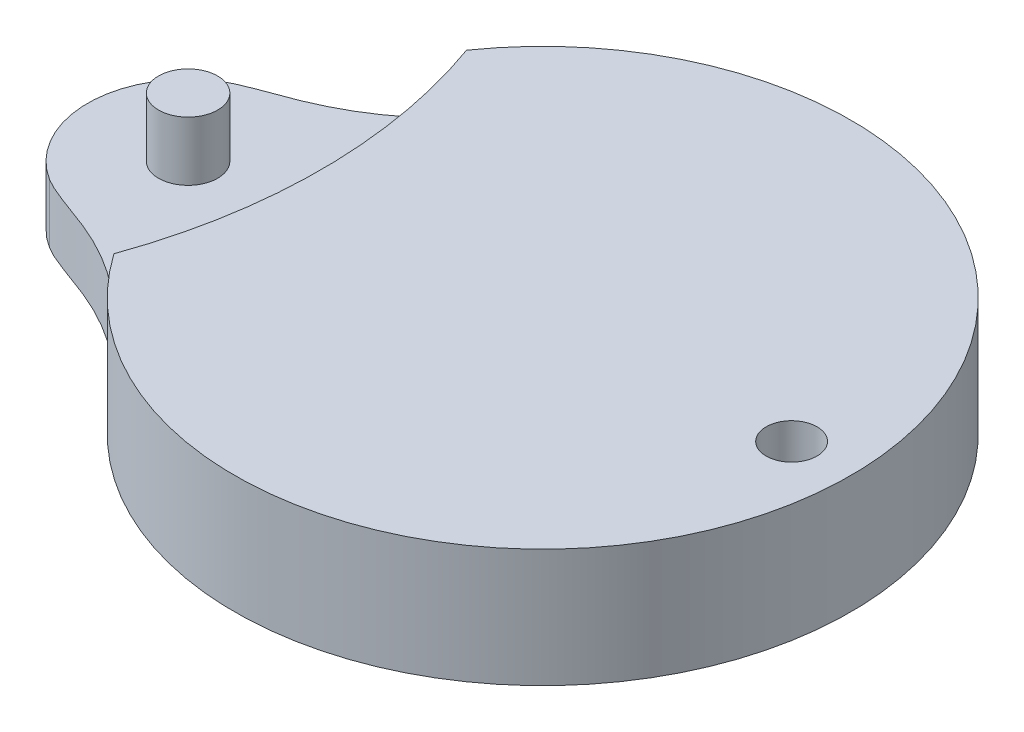
ISO-10303-21;
HEADER;
FILE_DESCRIPTION(('STEP AP214'),'2;1');
FILE_NAME('part.step','',(''),(''),'','','');
FILE_SCHEMA(('AUTOMOTIVE_DESIGN { 1 0 10303 214 1 1 1 1 }'));
ENDSEC;
DATA;
#1=APPLICATION_CONTEXT('core data for automotive mechanical design processes');
#2=APPLICATION_PROTOCOL_DEFINITION('international standard','automotive_design',2000,#1);
#3=PRODUCT_CONTEXT('',#1,'mechanical');
#4=PRODUCT('Part','Part','',(#3));
#5=PRODUCT_RELATED_PRODUCT_CATEGORY('part','',(#4));
#6=PRODUCT_DEFINITION_FORMATION('','',#4);
#7=PRODUCT_DEFINITION_CONTEXT('part definition',#1,'design');
#8=PRODUCT_DEFINITION('design','',#6,#7);
#9=PRODUCT_DEFINITION_SHAPE('','',#8);
#10=(LENGTH_UNIT() NAMED_UNIT(*) SI_UNIT(.MILLI.,.METRE.));
#11=(NAMED_UNIT(*) PLANE_ANGLE_UNIT() SI_UNIT($,.RADIAN.));
#12=(NAMED_UNIT(*) SI_UNIT($,.STERADIAN.) SOLID_ANGLE_UNIT());
#13=UNCERTAINTY_MEASURE_WITH_UNIT(LENGTH_MEASURE(1.E-05),#10,'distance_accuracy_value','');
#14=(GEOMETRIC_REPRESENTATION_CONTEXT(3) GLOBAL_UNCERTAINTY_ASSIGNED_CONTEXT((#13)) GLOBAL_UNIT_ASSIGNED_CONTEXT((#10,
#11,#12)) REPRESENTATION_CONTEXT('',''));
#15=CARTESIAN_POINT('',(0.,0.,0.));
#16=DIRECTION('',(0.,0.,1.));
#17=DIRECTION('',(1.,0.,0.));
#18=AXIS2_PLACEMENT_3D('',#15,#16,#17);
#19=CARTESIAN_POINT('',(0.,5.,0.));
#20=DIRECTION('',(0.,1.,0.));
#21=DIRECTION('',(0.,0.,1.));
#22=AXIS2_PLACEMENT_3D('',#19,#20,#21);
#23=PLANE('',#22);
#24=CARTESIAN_POINT('',(32.7560616139069,5.,0.));
#25=DIRECTION('',(0.,1.,0.));
#26=DIRECTION('',(0.,0.,1.));
#27=AXIS2_PLACEMENT_3D('',#24,#25,#26);
#28=CIRCLE('',#27,2.5);
#29=CARTESIAN_POINT('',(32.7560616139069,5.,2.5));
#30=VERTEX_POINT('',#29);
#31=EDGE_CURVE('E199',#30,#30,#28,.F.);
#32=ORIENTED_EDGE('',*,*,#31,.T.);
#33=EDGE_LOOP('',(#32));
#34=FACE_BOUND('',#33,.T.);
#35=CARTESIAN_POINT('',(28.2252052583613,5.,7.19175504904138));
#36=CARTESIAN_POINT('',(30.8163739671608,5.,8.82420959351587));
#37=CARTESIAN_POINT('',(35.6101150350221,5.,8.93526722884512));
#38=CARTESIAN_POINT('',(41.3963466522489,5.,14.9111530019259));
#39=B_SPLINE_CURVE_WITH_KNOTS('',3,(#35,#36,#37,#38),.UNSPECIFIED.,.F.,.F.,(4,4),(0.,1.),.UNSPECIFIED.);
#40=CARTESIAN_POINT('',(28.2252052583613,5.,7.19175504904139));
#41=VERTEX_POINT('',#40);
#42=CARTESIAN_POINT('',(41.3963466522489,5.,14.9111530019259));
#43=VERTEX_POINT('',#42);
#44=EDGE_CURVE('E176',#41,#43,#39,.T.);
#45=ORIENTED_EDGE('',*,*,#44,.T.);
#46=CARTESIAN_POINT('',(0.,5.,0.));
#47=DIRECTION('',(0.,1.,0.));
#48=DIRECTION('',(0.,0.,1.));
#49=AXIS2_PLACEMENT_3D('',#46,#47,#48);
#50=CIRCLE('',#49,44.);
#51=CARTESIAN_POINT('',(41.3963466522489,5.,-14.9111530019259));
#52=VERTEX_POINT('',#51);
#53=EDGE_CURVE('E112',#43,#52,#50,.T.);
#54=ORIENTED_EDGE('',*,*,#53,.T.);
#55=CARTESIAN_POINT('',(28.2252052583613,5.,-7.19175504904138));
#56=CARTESIAN_POINT('',(30.8163739671608,5.,-8.82420959351587));
#57=CARTESIAN_POINT('',(35.6101150350221,5.,-8.93526722884512));
#58=CARTESIAN_POINT('',(41.3963466522489,5.,-14.9111530019259));
#59=B_SPLINE_CURVE_WITH_KNOTS('',3,(#55,#56,#57,#58),.UNSPECIFIED.,.F.,.F.,(4,4),(0.,1.),.UNSPECIFIED.);
#60=CARTESIAN_POINT('',(28.2252052583613,5.,-7.19175504904139));
#61=VERTEX_POINT('',#60);
#62=EDGE_CURVE('E179',#61,#52,#59,.T.);
#63=ORIENTED_EDGE('',*,*,#62,.F.);
#64=CARTESIAN_POINT('',(32.7560616139069,5.,0.));
#65=DIRECTION('',(0.,1.,0.));
#66=DIRECTION('',(0.,0.,1.));
#67=AXIS2_PLACEMENT_3D('',#64,#65,#66);
#68=CIRCLE('',#67,8.50000000000001);
#69=EDGE_CURVE('E166',#61,#41,#68,.T.);
#70=ORIENTED_EDGE('',*,*,#69,.T.);
#71=EDGE_LOOP('',(#45,#54,#63,#70));
#72=FACE_BOUND('',#71,.T.);
#73=ADVANCED_FACE('F44',(#34,#72),#23,.T.);
#74=DIRECTION('',(0.,-1.,0.));
#75=VECTOR('',#74,1.);
#76=SURFACE_OF_LINEAR_EXTRUSION('',#59,#75);
#77=CARTESIAN_POINT('',(28.2252052583613,0.,-7.19175504904138));
#78=CARTESIAN_POINT('',(30.8163739671608,0.,-8.82420959351587));
#79=CARTESIAN_POINT('',(35.6101150350221,0.,-8.93526722884512));
#80=CARTESIAN_POINT('',(41.3963466522489,0.,-14.9111530019259));
#81=B_SPLINE_CURVE_WITH_KNOTS('',3,(#77,#78,#79,#80),.UNSPECIFIED.,.F.,.F.,(4,4),(0.,1.),.UNSPECIFIED.);
#82=CARTESIAN_POINT('',(28.2252052583613,0.,-7.19175504904139));
#83=VERTEX_POINT('',#82);
#84=CARTESIAN_POINT('',(41.3963466522489,0.,-14.9111530019259));
#85=VERTEX_POINT('',#84);
#86=EDGE_CURVE('E167',#83,#85,#81,.T.);
#87=ORIENTED_EDGE('',*,*,#86,.F.);
#88=DIRECTION('',(0.,-1.,0.));
#89=VECTOR('',#88,1.);
#90=CARTESIAN_POINT('',(28.2252052583613,5.,-7.19175504904139));
#91=LINE('',#90,#89);
#92=EDGE_CURVE('E11',#61,#83,#91,.T.);
#93=ORIENTED_EDGE('',*,*,#92,.F.);
#94=ORIENTED_EDGE('',*,*,#62,.T.);
#95=DIRECTION('',(0.,-1.,0.));
#96=VECTOR('',#95,1.);
#97=CARTESIAN_POINT('',(41.3963466522489,5.,-14.9111530019259));
#98=LINE('',#97,#96);
#99=EDGE_CURVE('E89',#52,#85,#98,.T.);
#100=ORIENTED_EDGE('',*,*,#99,.T.);
#101=EDGE_LOOP('',(#87,#93,#94,#100));
#102=FACE_BOUND('',#101,.T.);
#103=ADVANCED_FACE('F46',(#102),#76,.T.);
#104=CARTESIAN_POINT('',(32.7560616139069,5.,0.));
#105=DIRECTION('',(0.,-1.,0.));
#106=DIRECTION('',(0.,0.,-1.));
#107=AXIS2_PLACEMENT_3D('',#104,#105,#106);
#108=CYLINDRICAL_SURFACE('',#107,8.50000000000001);
#109=CARTESIAN_POINT('',(32.7560616139069,0.,0.));
#110=DIRECTION('',(0.,1.,0.));
#111=DIRECTION('',(0.,0.,1.));
#112=AXIS2_PLACEMENT_3D('',#109,#110,#111);
#113=CIRCLE('',#112,8.50000000000001);
#114=CARTESIAN_POINT('',(28.2252052583613,0.,7.19175504904139));
#115=VERTEX_POINT('',#114);
#116=EDGE_CURVE('E192',#83,#115,#113,.T.);
#117=ORIENTED_EDGE('',*,*,#116,.T.);
#118=DIRECTION('',(0.,-1.,0.));
#119=VECTOR('',#118,1.);
#120=CARTESIAN_POINT('',(28.2252052583613,5.,7.19175504904139));
#121=LINE('',#120,#119);
#122=EDGE_CURVE('E55',#41,#115,#121,.T.);
#123=ORIENTED_EDGE('',*,*,#122,.F.);
#124=ORIENTED_EDGE('',*,*,#69,.F.);
#125=ORIENTED_EDGE('',*,*,#92,.T.);
#126=EDGE_LOOP('',(#117,#123,#124,#125));
#127=FACE_BOUND('',#126,.T.);
#128=ADVANCED_FACE('F146',(#127),#108,.T.);
#129=DIRECTION('',(0.,-1.,0.));
#130=VECTOR('',#129,1.);
#131=SURFACE_OF_LINEAR_EXTRUSION('',#39,#130);
#132=CARTESIAN_POINT('',(28.2252052583613,0.,7.19175504904138));
#133=CARTESIAN_POINT('',(30.8163739671608,0.,8.82420959351587));
#134=CARTESIAN_POINT('',(35.6101150350221,0.,8.93526722884512));
#135=CARTESIAN_POINT('',(41.3963466522489,0.,14.9111530019259));
#136=B_SPLINE_CURVE_WITH_KNOTS('',3,(#132,#133,#134,#135),.UNSPECIFIED.,.F.,.F.,(4,4),(0.,1.),.UNSPECIFIED.);
#137=CARTESIAN_POINT('',(41.3963466522489,0.,14.9111530019259));
#138=VERTEX_POINT('',#137);
#139=EDGE_CURVE('E189',#115,#138,#136,.T.);
#140=ORIENTED_EDGE('',*,*,#139,.T.);
#141=DIRECTION('',(0.,-1.,0.));
#142=VECTOR('',#141,1.);
#143=CARTESIAN_POINT('',(41.3963466522489,5.,14.9111530019259));
#144=LINE('',#143,#142);
#145=EDGE_CURVE('E82',#43,#138,#144,.T.);
#146=ORIENTED_EDGE('',*,*,#145,.F.);
#147=ORIENTED_EDGE('',*,*,#44,.F.);
#148=ORIENTED_EDGE('',*,*,#122,.T.);
#149=EDGE_LOOP('',(#140,#146,#147,#148));
#150=FACE_BOUND('',#149,.T.);
#151=ADVANCED_FACE('F157',(#150),#131,.F.);
#152=CARTESIAN_POINT('',(62.7560616139069,5.,0.));
#153=DIRECTION('',(0.,-1.,0.));
#154=DIRECTION('',(0.,0.,-1.));
#155=AXIS2_PLACEMENT_3D('',#152,#153,#154);
#156=CYLINDRICAL_SURFACE('',#155,26.0495663512873);
#157=CARTESIAN_POINT('',(62.7560616139069,0.,0.));
#158=DIRECTION('',(0.,1.,0.));
#159=DIRECTION('',(0.,0.,1.));
#160=AXIS2_PLACEMENT_3D('',#157,#158,#159);
#161=CIRCLE('',#160,26.0495663512873);
#162=EDGE_CURVE('E186',#85,#138,#161,.F.);
#163=ORIENTED_EDGE('',*,*,#162,.F.);
#164=ORIENTED_EDGE('',*,*,#99,.F.);
#165=DIRECTION('',(0.,-1.,0.));
#166=VECTOR('',#165,1.);
#167=CARTESIAN_POINT('',(41.3963466522489,10.,-14.9111530019259));
#168=LINE('',#167,#166);
#169=CARTESIAN_POINT('',(41.3963466522489,10.,-14.9111530019259));
#170=VERTEX_POINT('',#169);
#171=EDGE_CURVE('E64',#170,#52,#168,.T.);
#172=ORIENTED_EDGE('',*,*,#171,.F.);
#173=CARTESIAN_POINT('',(62.7560616139069,10.,0.));
#174=DIRECTION('',(0.,-1.,0.));
#175=DIRECTION('',(0.,0.,-1.));
#176=AXIS2_PLACEMENT_3D('',#173,#174,#175);
#177=CIRCLE('',#176,26.0495663512873);
#178=CARTESIAN_POINT('',(41.3963466522489,10.,14.9111530019259));
#179=VERTEX_POINT('',#178);
#180=EDGE_CURVE('E102',#170,#179,#177,.T.);
#181=ORIENTED_EDGE('',*,*,#180,.T.);
#182=DIRECTION('',(0.,-1.,0.));
#183=VECTOR('',#182,1.);
#184=CARTESIAN_POINT('',(41.3963466522489,10.,14.9111530019259));
#185=LINE('',#184,#183);
#186=EDGE_CURVE('E103',#179,#43,#185,.T.);
#187=ORIENTED_EDGE('',*,*,#186,.T.);
#188=ORIENTED_EDGE('',*,*,#145,.T.);
#189=EDGE_LOOP('',(#163,#164,#172,#181,#187,#188));
#190=FACE_BOUND('',#189,.T.);
#191=ADVANCED_FACE('F100',(#190),#156,.T.);
#192=CARTESIAN_POINT('',(0.,0.,0.));
#193=DIRECTION('',(0.,1.,0.));
#194=DIRECTION('',(0.,0.,1.));
#195=AXIS2_PLACEMENT_3D('',#192,#193,#194);
#196=PLANE('',#195);
#197=CARTESIAN_POINT('',(83.8056279651942,0.,0.));
#198=DIRECTION('',(0.,1.,0.));
#199=DIRECTION('',(0.,0.,1.));
#200=AXIS2_PLACEMENT_3D('',#197,#198,#199);
#201=CIRCLE('',#200,2.15);
#202=CARTESIAN_POINT('',(83.8056279651942,0.,2.15));
#203=VERTEX_POINT('',#202);
#204=EDGE_CURVE('E124',#203,#203,#201,.T.);
#205=ORIENTED_EDGE('',*,*,#204,.T.);
#206=EDGE_LOOP('',(#205));
#207=FACE_BOUND('',#206,.T.);
#208=ORIENTED_EDGE('',*,*,#162,.T.);
#209=ORIENTED_EDGE('',*,*,#139,.F.);
#210=ORIENTED_EDGE('',*,*,#116,.F.);
#211=ORIENTED_EDGE('',*,*,#86,.T.);
#212=EDGE_LOOP('',(#208,#209,#210,#211));
#213=FACE_BOUND('',#212,.T.);
#214=ADVANCED_FACE('F128',(#207,#213),#196,.F.);
#215=CARTESIAN_POINT('',(32.7560616139069,10.,0.));
#216=DIRECTION('',(0.,-1.,0.));
#217=DIRECTION('',(0.,0.,-1.));
#218=AXIS2_PLACEMENT_3D('',#215,#216,#217);
#219=CYLINDRICAL_SURFACE('',#218,2.5);
#220=ORIENTED_EDGE('',*,*,#31,.F.);
#221=EDGE_LOOP('',(#220));
#222=FACE_BOUND('',#221,.T.);
#223=CARTESIAN_POINT('',(32.7560616139069,10.,0.));
#224=DIRECTION('',(0.,1.,0.));
#225=DIRECTION('',(0.,0.,1.));
#226=AXIS2_PLACEMENT_3D('',#223,#224,#225);
#227=CIRCLE('',#226,2.5);
#228=CARTESIAN_POINT('',(32.7560616139069,10.,2.5));
#229=VERTEX_POINT('',#228);
#230=EDGE_CURVE('E114',#229,#229,#227,.T.);
#231=ORIENTED_EDGE('',*,*,#230,.F.);
#232=EDGE_LOOP('',(#231));
#233=FACE_BOUND('',#232,.T.);
#234=ADVANCED_FACE('F151',(#222,#233),#219,.T.);
#235=CARTESIAN_POINT('',(0.,10.,0.));
#236=DIRECTION('',(0.,1.,0.));
#237=DIRECTION('',(0.,0.,1.));
#238=AXIS2_PLACEMENT_3D('',#235,#236,#237);
#239=PLANE('',#238);
#240=ORIENTED_EDGE('',*,*,#230,.T.);
#241=EDGE_LOOP('',(#240));
#242=FACE_BOUND('',#241,.T.);
#243=ADVANCED_FACE('F215',(#242),#239,.T.);
#244=CARTESIAN_POINT('',(31.3780308069534,10.,0.));
#245=DIRECTION('',(0.,-1.,0.));
#246=DIRECTION('',(0.,0.,-1.));
#247=AXIS2_PLACEMENT_3D('',#244,#245,#246);
#248=PLANE('',#247);
#249=CARTESIAN_POINT('',(83.8056279651942,10.,0.));
#250=DIRECTION('',(0.,-1.,0.));
#251=DIRECTION('',(0.,0.,-1.));
#252=AXIS2_PLACEMENT_3D('',#249,#250,#251);
#253=CIRCLE('',#252,2.15);
#254=CARTESIAN_POINT('',(83.8056279651942,10.,-2.15));
#255=VERTEX_POINT('',#254);
#256=EDGE_CURVE('E104',#255,#255,#253,.T.);
#257=ORIENTED_EDGE('',*,*,#256,.T.);
#258=EDGE_LOOP('',(#257));
#259=FACE_BOUND('',#258,.T.);
#260=ORIENTED_EDGE('',*,*,#180,.F.);
#261=CARTESIAN_POINT('',(0.,10.,0.));
#262=DIRECTION('',(0.,-1.,0.));
#263=DIRECTION('',(0.,0.,-1.));
#264=AXIS2_PLACEMENT_3D('',#261,#262,#263);
#265=CIRCLE('',#264,44.);
#266=EDGE_CURVE('E107',#170,#179,#265,.T.);
#267=ORIENTED_EDGE('',*,*,#266,.T.);
#268=EDGE_LOOP('',(#260,#267));
#269=FACE_BOUND('',#268,.T.);
#270=ADVANCED_FACE('F111',(#259,#269),#248,.F.);
#271=CARTESIAN_POINT('',(0.,10.,0.));
#272=DIRECTION('',(0.,-1.,0.));
#273=DIRECTION('',(0.,0.,-1.));
#274=AXIS2_PLACEMENT_3D('',#271,#272,#273);
#275=CYLINDRICAL_SURFACE('',#274,44.);
#276=ORIENTED_EDGE('',*,*,#53,.F.);
#277=ORIENTED_EDGE('',*,*,#186,.F.);
#278=ORIENTED_EDGE('',*,*,#266,.F.);
#279=ORIENTED_EDGE('',*,*,#171,.T.);
#280=EDGE_LOOP('',(#276,#277,#278,#279));
#281=FACE_BOUND('',#280,.T.);
#282=ADVANCED_FACE('F108',(#281),#275,.F.);
#283=CARTESIAN_POINT('',(83.8056279651942,16.0811183182043,0.));
#284=DIRECTION('',(0.,-1.,0.));
#285=DIRECTION('',(0.,0.,-1.));
#286=AXIS2_PLACEMENT_3D('',#283,#284,#285);
#287=CYLINDRICAL_SURFACE('',#286,2.15);
#288=ORIENTED_EDGE('',*,*,#256,.F.);
#289=EDGE_LOOP('',(#288));
#290=FACE_BOUND('',#289,.T.);
#291=ORIENTED_EDGE('',*,*,#204,.F.);
#292=EDGE_LOOP('',(#291));
#293=FACE_BOUND('',#292,.T.);
#294=ADVANCED_FACE('F131',(#290,#293),#287,.F.);
#295=CLOSED_SHELL('',(#73,#103,#128,#151,#191,#214,#234,#243,#270,#282,#294));
#296=MANIFOLD_SOLID_BREP('B2',#295);
#297=ADVANCED_BREP_SHAPE_REPRESENTATION('',(#18,#296),#14);
#298=SHAPE_DEFINITION_REPRESENTATION(#9,#297);
ENDSEC;
END-ISO-10303-21;
